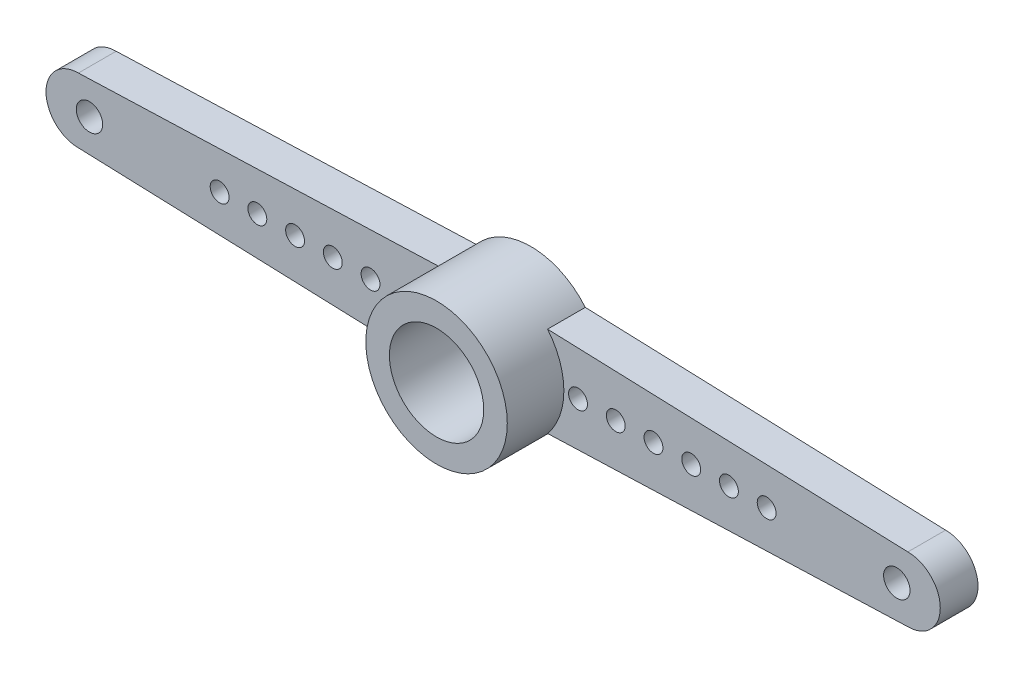
ISO-10303-21;
HEADER;
FILE_DESCRIPTION(('STEP AP214'),'2;1');
FILE_NAME('part.step','',(''),(''),'','','');
FILE_SCHEMA(('AUTOMOTIVE_DESIGN { 1 0 10303 214 1 1 1 1 }'));
ENDSEC;
DATA;
#1=APPLICATION_CONTEXT('core data for automotive mechanical design processes');
#2=APPLICATION_PROTOCOL_DEFINITION('international standard','automotive_design',2000,#1);
#3=PRODUCT_CONTEXT('',#1,'mechanical');
#4=PRODUCT('Part','Part','',(#3));
#5=PRODUCT_RELATED_PRODUCT_CATEGORY('part','',(#4));
#6=PRODUCT_DEFINITION_FORMATION('','',#4);
#7=PRODUCT_DEFINITION_CONTEXT('part definition',#1,'design');
#8=PRODUCT_DEFINITION('design','',#6,#7);
#9=PRODUCT_DEFINITION_SHAPE('','',#8);
#10=(LENGTH_UNIT() NAMED_UNIT(*) SI_UNIT(.MILLI.,.METRE.));
#11=(NAMED_UNIT(*) PLANE_ANGLE_UNIT() SI_UNIT($,.RADIAN.));
#12=(NAMED_UNIT(*) SI_UNIT($,.STERADIAN.) SOLID_ANGLE_UNIT());
#13=UNCERTAINTY_MEASURE_WITH_UNIT(LENGTH_MEASURE(1.E-05),#10,'distance_accuracy_value','');
#14=(GEOMETRIC_REPRESENTATION_CONTEXT(3) GLOBAL_UNCERTAINTY_ASSIGNED_CONTEXT((#13)) GLOBAL_UNIT_ASSIGNED_CONTEXT((#10,
#11,#12)) REPRESENTATION_CONTEXT('',''));
#15=CARTESIAN_POINT('',(0.,0.,0.));
#16=DIRECTION('',(0.,0.,1.));
#17=DIRECTION('',(1.,0.,0.));
#18=AXIS2_PLACEMENT_3D('',#15,#16,#17);
#19=CARTESIAN_POINT('',(0.,0.,0.));
#20=DIRECTION('',(0.,0.,1.));
#21=DIRECTION('',(1.,0.,0.));
#22=AXIS2_PLACEMENT_3D('',#19,#20,#21);
#23=CYLINDRICAL_SURFACE('',#22,2.5);
#24=CARTESIAN_POINT('',(0.,0.,5.));
#25=DIRECTION('',(0.,0.,1.));
#26=DIRECTION('',(1.,0.,0.));
#27=AXIS2_PLACEMENT_3D('',#24,#25,#26);
#28=CIRCLE('',#27,2.5);
#29=CARTESIAN_POINT('',(2.5,0.,5.));
#30=VERTEX_POINT('',#29);
#31=EDGE_CURVE('E215',#30,#30,#28,.T.);
#32=ORIENTED_EDGE('',*,*,#31,.T.);
#33=EDGE_LOOP('',(#32));
#34=FACE_BOUND('',#33,.T.);
#35=CARTESIAN_POINT('',(0.,0.,1.));
#36=DIRECTION('',(0.,0.,-1.));
#37=DIRECTION('',(-1.,0.,0.));
#38=AXIS2_PLACEMENT_3D('',#35,#36,#37);
#39=CIRCLE('',#38,2.5);
#40=CARTESIAN_POINT('',(-2.5,0.,1.));
#41=VERTEX_POINT('',#40);
#42=EDGE_CURVE('E288',#41,#41,#39,.T.);
#43=ORIENTED_EDGE('',*,*,#42,.T.);
#44=EDGE_LOOP('',(#43));
#45=FACE_BOUND('',#44,.T.);
#46=ADVANCED_FACE('F43',(#34,#45),#23,.F.);
#47=CARTESIAN_POINT('',(0.,0.,2.));
#48=DIRECTION('',(0.,0.,1.));
#49=DIRECTION('',(1.,0.,0.));
#50=AXIS2_PLACEMENT_3D('',#47,#48,#49);
#51=PLANE('',#50);
#52=CARTESIAN_POINT('',(-21.4,0.,2.));
#53=DIRECTION('',(0.,0.,-1.));
#54=DIRECTION('',(-1.,0.,0.));
#55=AXIS2_PLACEMENT_3D('',#52,#53,#54);
#56=CIRCLE('',#55,0.699999999999998);
#57=CARTESIAN_POINT('',(-22.1,0.,2.));
#58=VERTEX_POINT('',#57);
#59=EDGE_CURVE('E305',#58,#58,#56,.T.);
#60=ORIENTED_EDGE('',*,*,#59,.T.);
#61=EDGE_LOOP('',(#60));
#62=FACE_BOUND('',#61,.T.);
#63=CARTESIAN_POINT('',(-12.5,0.,2.));
#64=DIRECTION('',(0.,0.,-1.));
#65=DIRECTION('',(-1.,0.,0.));
#66=AXIS2_PLACEMENT_3D('',#63,#64,#65);
#67=CIRCLE('',#66,0.500000000000001);
#68=CARTESIAN_POINT('',(-13.,0.,2.));
#69=VERTEX_POINT('',#68);
#70=EDGE_CURVE('E273',#69,#69,#67,.F.);
#71=ORIENTED_EDGE('',*,*,#70,.F.);
#72=EDGE_LOOP('',(#71));
#73=FACE_BOUND('',#72,.T.);
#74=CARTESIAN_POINT('',(-8.5,0.,2.));
#75=DIRECTION('',(0.,0.,-1.));
#76=DIRECTION('',(-1.,0.,0.));
#77=AXIS2_PLACEMENT_3D('',#74,#75,#76);
#78=CIRCLE('',#77,0.500000000000001);
#79=CARTESIAN_POINT('',(-9.,0.,2.));
#80=VERTEX_POINT('',#79);
#81=EDGE_CURVE('E261',#80,#80,#78,.F.);
#82=ORIENTED_EDGE('',*,*,#81,.F.);
#83=EDGE_LOOP('',(#82));
#84=FACE_BOUND('',#83,.T.);
#85=CARTESIAN_POINT('',(-4.5,0.,2.));
#86=DIRECTION('',(0.,0.,-1.));
#87=DIRECTION('',(-1.,0.,0.));
#88=AXIS2_PLACEMENT_3D('',#85,#86,#87);
#89=CIRCLE('',#88,0.500000000000001);
#90=CARTESIAN_POINT('',(-5.,0.,2.));
#91=VERTEX_POINT('',#90);
#92=EDGE_CURVE('E249',#91,#91,#89,.F.);
#93=ORIENTED_EDGE('',*,*,#92,.F.);
#94=EDGE_LOOP('',(#93));
#95=FACE_BOUND('',#94,.T.);
#96=CARTESIAN_POINT('',(0.,0.,2.));
#97=DIRECTION('',(0.,0.,1.));
#98=DIRECTION('',(1.,0.,0.));
#99=AXIS2_PLACEMENT_3D('',#96,#97,#98);
#100=CIRCLE('',#99,3.75);
#101=CARTESIAN_POINT('',(-2.88547071027724,2.39511143376089,2.));
#102=VERTEX_POINT('',#101);
#103=CARTESIAN_POINT('',(-2.88547071027724,-2.39511143376089,2.));
#104=VERTEX_POINT('',#103);
#105=EDGE_CURVE('E12',#102,#104,#100,.T.);
#106=ORIENTED_EDGE('',*,*,#105,.F.);
#107=DIRECTION('',(0.999372730394994,0.0354139201848026,0.));
#108=VECTOR('',#107,1.);
#109=CARTESIAN_POINT('',(-0.0883858807695831,2.49422934631706,2.));
#110=LINE('',#109,#108);
#111=CARTESIAN_POINT('',(-21.9862000686899,1.71825515742145,2.));
#112=VERTEX_POINT('',#111);
#113=EDGE_CURVE('E174',#112,#102,#110,.T.);
#114=ORIENTED_EDGE('',*,*,#113,.F.);
#115=CARTESIAN_POINT('',(-21.9862000686899,0.,2.));
#116=DIRECTION('',(0.,0.,1.));
#117=DIRECTION('',(1.,0.,0.));
#118=AXIS2_PLACEMENT_3D('',#115,#116,#117);
#119=CIRCLE('',#118,1.71825515742145);
#120=CARTESIAN_POINT('',(-21.9862000686899,-1.71825515742145,2.));
#121=VERTEX_POINT('',#120);
#122=EDGE_CURVE('E181',#112,#121,#119,.T.);
#123=ORIENTED_EDGE('',*,*,#122,.T.);
#124=DIRECTION('',(0.999372730394994,-0.0354139201848024,0.));
#125=VECTOR('',#124,1.);
#126=CARTESIAN_POINT('',(-0.0883858807695825,-2.49422934631706,2.));
#127=LINE('',#126,#125);
#128=EDGE_CURVE('E186',#121,#104,#127,.T.);
#129=ORIENTED_EDGE('',*,*,#128,.T.);
#130=EDGE_LOOP('',(#106,#114,#123,#129));
#131=FACE_BOUND('',#130,.T.);
#132=CARTESIAN_POINT('',(-6.5,0.,2.));
#133=DIRECTION('',(0.,0.,-1.));
#134=DIRECTION('',(-1.,0.,0.));
#135=AXIS2_PLACEMENT_3D('',#132,#133,#134);
#136=CIRCLE('',#135,0.500000000000001);
#137=CARTESIAN_POINT('',(-7.,0.,2.));
#138=VERTEX_POINT('',#137);
#139=EDGE_CURVE('E255',#138,#138,#136,.F.);
#140=ORIENTED_EDGE('',*,*,#139,.F.);
#141=EDGE_LOOP('',(#140));
#142=FACE_BOUND('',#141,.T.);
#143=CARTESIAN_POINT('',(-10.5,0.,2.));
#144=DIRECTION('',(0.,0.,-1.));
#145=DIRECTION('',(-1.,0.,0.));
#146=AXIS2_PLACEMENT_3D('',#143,#144,#145);
#147=CIRCLE('',#146,0.500000000000001);
#148=CARTESIAN_POINT('',(-11.,0.,2.));
#149=VERTEX_POINT('',#148);
#150=EDGE_CURVE('E267',#149,#149,#147,.F.);
#151=ORIENTED_EDGE('',*,*,#150,.F.);
#152=EDGE_LOOP('',(#151));
#153=FACE_BOUND('',#152,.T.);
#154=CARTESIAN_POINT('',(-14.5,0.,2.));
#155=DIRECTION('',(0.,0.,-1.));
#156=DIRECTION('',(-1.,0.,0.));
#157=AXIS2_PLACEMENT_3D('',#154,#155,#156);
#158=CIRCLE('',#157,0.500000000000001);
#159=CARTESIAN_POINT('',(-15.,0.,2.));
#160=VERTEX_POINT('',#159);
#161=EDGE_CURVE('E279',#160,#160,#158,.F.);
#162=ORIENTED_EDGE('',*,*,#161,.F.);
#163=EDGE_LOOP('',(#162));
#164=FACE_BOUND('',#163,.T.);
#165=ADVANCED_FACE('F188',(#62,#73,#84,#95,#131,#142,#153,#164),#51,.T.);
#166=CARTESIAN_POINT('',(0.,0.,0.));
#167=DIRECTION('',(0.,0.,1.));
#168=DIRECTION('',(1.,0.,0.));
#169=AXIS2_PLACEMENT_3D('',#166,#167,#168);
#170=PLANE('',#169);
#171=CARTESIAN_POINT('',(21.4,0.,0.));
#172=DIRECTION('',(0.,0.,-1.));
#173=DIRECTION('',(-1.,0.,0.));
#174=AXIS2_PLACEMENT_3D('',#171,#172,#173);
#175=CIRCLE('',#174,0.699999999999998);
#176=CARTESIAN_POINT('',(20.7,0.,0.));
#177=VERTEX_POINT('',#176);
#178=EDGE_CURVE('E312',#177,#177,#175,.T.);
#179=ORIENTED_EDGE('',*,*,#178,.F.);
#180=EDGE_LOOP('',(#179));
#181=FACE_BOUND('',#180,.T.);
#182=CARTESIAN_POINT('',(-21.4,0.,0.));
#183=DIRECTION('',(0.,0.,-1.));
#184=DIRECTION('',(-1.,0.,0.));
#185=AXIS2_PLACEMENT_3D('',#182,#183,#184);
#186=CIRCLE('',#185,0.699999999999998);
#187=CARTESIAN_POINT('',(-22.1,0.,0.));
#188=VERTEX_POINT('',#187);
#189=EDGE_CURVE('E306',#188,#188,#186,.T.);
#190=ORIENTED_EDGE('',*,*,#189,.F.);
#191=EDGE_LOOP('',(#190));
#192=FACE_BOUND('',#191,.T.);
#193=CARTESIAN_POINT('',(0.,0.,0.));
#194=DIRECTION('',(0.,0.,-1.));
#195=DIRECTION('',(-1.,0.,0.));
#196=AXIS2_PLACEMENT_3D('',#193,#194,#195);
#197=CIRCLE('',#196,2.5);
#198=CARTESIAN_POINT('',(-2.5,0.,0.));
#199=VERTEX_POINT('',#198);
#200=EDGE_CURVE('E294',#199,#199,#197,.T.);
#201=ORIENTED_EDGE('',*,*,#200,.F.);
#202=EDGE_LOOP('',(#201));
#203=FACE_BOUND('',#202,.T.);
#204=CARTESIAN_POINT('',(12.5,0.,0.));
#205=DIRECTION('',(0.,0.,-1.));
#206=DIRECTION('',(-1.,0.,0.));
#207=AXIS2_PLACEMENT_3D('',#204,#205,#206);
#208=CIRCLE('',#207,0.500000000000001);
#209=CARTESIAN_POINT('',(12.,0.,0.));
#210=VERTEX_POINT('',#209);
#211=EDGE_CURVE('E282',#210,#210,#208,.T.);
#212=ORIENTED_EDGE('',*,*,#211,.F.);
#213=EDGE_LOOP('',(#212));
#214=FACE_BOUND('',#213,.T.);
#215=CARTESIAN_POINT('',(4.5,0.,0.));
#216=DIRECTION('',(0.,0.,-1.));
#217=DIRECTION('',(-1.,0.,0.));
#218=AXIS2_PLACEMENT_3D('',#215,#216,#217);
#219=CIRCLE('',#218,0.500000000000001);
#220=CARTESIAN_POINT('',(4.,0.,0.));
#221=VERTEX_POINT('',#220);
#222=EDGE_CURVE('E240',#221,#221,#219,.T.);
#223=ORIENTED_EDGE('',*,*,#222,.F.);
#224=EDGE_LOOP('',(#223));
#225=FACE_BOUND('',#224,.T.);
#226=CARTESIAN_POINT('',(6.5,0.,0.));
#227=DIRECTION('',(0.,0.,-1.));
#228=DIRECTION('',(-1.,0.,0.));
#229=AXIS2_PLACEMENT_3D('',#226,#227,#228);
#230=CIRCLE('',#229,0.500000000000001);
#231=CARTESIAN_POINT('',(6.,0.,0.));
#232=VERTEX_POINT('',#231);
#233=EDGE_CURVE('E234',#232,#232,#230,.T.);
#234=ORIENTED_EDGE('',*,*,#233,.F.);
#235=EDGE_LOOP('',(#234));
#236=FACE_BOUND('',#235,.T.);
#237=CARTESIAN_POINT('',(8.5,0.,0.));
#238=DIRECTION('',(0.,0.,-1.));
#239=DIRECTION('',(-1.,0.,0.));
#240=AXIS2_PLACEMENT_3D('',#237,#238,#239);
#241=CIRCLE('',#240,0.500000000000001);
#242=CARTESIAN_POINT('',(8.,0.,0.));
#243=VERTEX_POINT('',#242);
#244=EDGE_CURVE('E228',#243,#243,#241,.T.);
#245=ORIENTED_EDGE('',*,*,#244,.F.);
#246=EDGE_LOOP('',(#245));
#247=FACE_BOUND('',#246,.T.);
#248=CARTESIAN_POINT('',(10.5,0.,0.));
#249=DIRECTION('',(0.,0.,-1.));
#250=DIRECTION('',(-1.,0.,0.));
#251=AXIS2_PLACEMENT_3D('',#248,#249,#250);
#252=CIRCLE('',#251,0.500000000000001);
#253=CARTESIAN_POINT('',(10.,0.,0.));
#254=VERTEX_POINT('',#253);
#255=EDGE_CURVE('E222',#254,#254,#252,.T.);
#256=ORIENTED_EDGE('',*,*,#255,.F.);
#257=EDGE_LOOP('',(#256));
#258=FACE_BOUND('',#257,.T.);
#259=CARTESIAN_POINT('',(14.5,0.,0.));
#260=DIRECTION('',(0.,0.,-1.));
#261=DIRECTION('',(-1.,0.,0.));
#262=AXIS2_PLACEMENT_3D('',#259,#260,#261);
#263=CIRCLE('',#262,0.500000000000001);
#264=CARTESIAN_POINT('',(14.,0.,0.));
#265=VERTEX_POINT('',#264);
#266=EDGE_CURVE('E219',#265,#265,#263,.T.);
#267=ORIENTED_EDGE('',*,*,#266,.F.);
#268=EDGE_LOOP('',(#267));
#269=FACE_BOUND('',#268,.T.);
#270=CARTESIAN_POINT('',(21.9862000686899,0.,0.));
#271=DIRECTION('',(0.,0.,1.));
#272=DIRECTION('',(1.,0.,0.));
#273=AXIS2_PLACEMENT_3D('',#270,#271,#272);
#274=CIRCLE('',#273,1.71825515742145);
#275=CARTESIAN_POINT('',(21.9862000686899,1.71825515742145,0.));
#276=VERTEX_POINT('',#275);
#277=CARTESIAN_POINT('',(21.9862000686899,-1.71825515742144,0.));
#278=VERTEX_POINT('',#277);
#279=EDGE_CURVE('E84',#276,#278,#274,.F.);
#280=ORIENTED_EDGE('',*,*,#279,.T.);
#281=DIRECTION('',(-0.999372730394994,-0.0354139201848029,0.));
#282=VECTOR('',#281,1.);
#283=CARTESIAN_POINT('',(0.0883858807695838,-2.49422934631706,0.));
#284=LINE('',#283,#282);
#285=CARTESIAN_POINT('',(2.88547071027724,-2.39511143376089,0.));
#286=VERTEX_POINT('',#285);
#287=EDGE_CURVE('E97',#278,#286,#284,.T.);
#288=ORIENTED_EDGE('',*,*,#287,.T.);
#289=CARTESIAN_POINT('',(0.,0.,0.));
#290=DIRECTION('',(0.,0.,-1.));
#291=DIRECTION('',(-1.,0.,0.));
#292=AXIS2_PLACEMENT_3D('',#289,#290,#291);
#293=CIRCLE('',#292,3.75);
#294=CARTESIAN_POINT('',(-2.88547071027724,-2.39511143376089,0.));
#295=VERTEX_POINT('',#294);
#296=EDGE_CURVE('E100',#286,#295,#293,.T.);
#297=ORIENTED_EDGE('',*,*,#296,.T.);
#298=DIRECTION('',(0.999372730394994,-0.0354139201848024,0.));
#299=VECTOR('',#298,1.);
#300=CARTESIAN_POINT('',(-0.0883858807695825,-2.49422934631706,0.));
#301=LINE('',#300,#299);
#302=CARTESIAN_POINT('',(-21.9862000686899,-1.71825515742145,0.));
#303=VERTEX_POINT('',#302);
#304=EDGE_CURVE('E190',#303,#295,#301,.T.);
#305=ORIENTED_EDGE('',*,*,#304,.F.);
#306=CARTESIAN_POINT('',(-21.9862000686899,0.,0.));
#307=DIRECTION('',(0.,0.,1.));
#308=DIRECTION('',(1.,0.,0.));
#309=AXIS2_PLACEMENT_3D('',#306,#307,#308);
#310=CIRCLE('',#309,1.71825515742145);
#311=CARTESIAN_POINT('',(-21.9862000686899,1.71825515742145,0.));
#312=VERTEX_POINT('',#311);
#313=EDGE_CURVE('E192',#312,#303,#310,.T.);
#314=ORIENTED_EDGE('',*,*,#313,.F.);
#315=DIRECTION('',(0.999372730394994,0.0354139201848026,0.));
#316=VECTOR('',#315,1.);
#317=CARTESIAN_POINT('',(-0.0883858807695831,2.49422934631706,0.));
#318=LINE('',#317,#316);
#319=CARTESIAN_POINT('',(-2.88547071027724,2.39511143376089,0.));
#320=VERTEX_POINT('',#319);
#321=EDGE_CURVE('E60',#312,#320,#318,.T.);
#322=ORIENTED_EDGE('',*,*,#321,.T.);
#323=CARTESIAN_POINT('',(2.88547071027724,2.39511143376089,0.));
#324=VERTEX_POINT('',#323);
#325=EDGE_CURVE('E177',#320,#324,#293,.T.);
#326=ORIENTED_EDGE('',*,*,#325,.T.);
#327=DIRECTION('',(-0.999372730394994,0.0354139201848023,0.));
#328=VECTOR('',#327,1.);
#329=CARTESIAN_POINT('',(0.0883858807695825,2.49422934631706,0.));
#330=LINE('',#329,#328);
#331=EDGE_CURVE('E99',#276,#324,#330,.T.);
#332=ORIENTED_EDGE('',*,*,#331,.F.);
#333=EDGE_LOOP('',(#280,#288,#297,#305,#314,#322,#326,#332));
#334=FACE_BOUND('',#333,.T.);
#335=CARTESIAN_POINT('',(-4.5,0.,0.));
#336=DIRECTION('',(0.,0.,-1.));
#337=DIRECTION('',(-1.,0.,0.));
#338=AXIS2_PLACEMENT_3D('',#335,#336,#337);
#339=CIRCLE('',#338,0.500000000000001);
#340=CARTESIAN_POINT('',(-5.,0.,0.));
#341=VERTEX_POINT('',#340);
#342=EDGE_CURVE('E246',#341,#341,#339,.F.);
#343=ORIENTED_EDGE('',*,*,#342,.T.);
#344=EDGE_LOOP('',(#343));
#345=FACE_BOUND('',#344,.T.);
#346=CARTESIAN_POINT('',(-6.5,0.,0.));
#347=DIRECTION('',(0.,0.,-1.));
#348=DIRECTION('',(-1.,0.,0.));
#349=AXIS2_PLACEMENT_3D('',#346,#347,#348);
#350=CIRCLE('',#349,0.500000000000001);
#351=CARTESIAN_POINT('',(-7.,0.,0.));
#352=VERTEX_POINT('',#351);
#353=EDGE_CURVE('E252',#352,#352,#350,.F.);
#354=ORIENTED_EDGE('',*,*,#353,.T.);
#355=EDGE_LOOP('',(#354));
#356=FACE_BOUND('',#355,.T.);
#357=CARTESIAN_POINT('',(-8.5,0.,0.));
#358=DIRECTION('',(0.,0.,-1.));
#359=DIRECTION('',(-1.,0.,0.));
#360=AXIS2_PLACEMENT_3D('',#357,#358,#359);
#361=CIRCLE('',#360,0.500000000000001);
#362=CARTESIAN_POINT('',(-9.,0.,0.));
#363=VERTEX_POINT('',#362);
#364=EDGE_CURVE('E258',#363,#363,#361,.F.);
#365=ORIENTED_EDGE('',*,*,#364,.T.);
#366=EDGE_LOOP('',(#365));
#367=FACE_BOUND('',#366,.T.);
#368=CARTESIAN_POINT('',(-10.5,0.,0.));
#369=DIRECTION('',(0.,0.,-1.));
#370=DIRECTION('',(-1.,0.,0.));
#371=AXIS2_PLACEMENT_3D('',#368,#369,#370);
#372=CIRCLE('',#371,0.500000000000001);
#373=CARTESIAN_POINT('',(-11.,0.,0.));
#374=VERTEX_POINT('',#373);
#375=EDGE_CURVE('E264',#374,#374,#372,.F.);
#376=ORIENTED_EDGE('',*,*,#375,.T.);
#377=EDGE_LOOP('',(#376));
#378=FACE_BOUND('',#377,.T.);
#379=CARTESIAN_POINT('',(-12.5,0.,0.));
#380=DIRECTION('',(0.,0.,-1.));
#381=DIRECTION('',(-1.,0.,0.));
#382=AXIS2_PLACEMENT_3D('',#379,#380,#381);
#383=CIRCLE('',#382,0.500000000000001);
#384=CARTESIAN_POINT('',(-13.,0.,0.));
#385=VERTEX_POINT('',#384);
#386=EDGE_CURVE('E270',#385,#385,#383,.F.);
#387=ORIENTED_EDGE('',*,*,#386,.T.);
#388=EDGE_LOOP('',(#387));
#389=FACE_BOUND('',#388,.T.);
#390=CARTESIAN_POINT('',(-14.5,0.,0.));
#391=DIRECTION('',(0.,0.,-1.));
#392=DIRECTION('',(-1.,0.,0.));
#393=AXIS2_PLACEMENT_3D('',#390,#391,#392);
#394=CIRCLE('',#393,0.500000000000001);
#395=CARTESIAN_POINT('',(-15.,0.,0.));
#396=VERTEX_POINT('',#395);
#397=EDGE_CURVE('E276',#396,#396,#394,.F.);
#398=ORIENTED_EDGE('',*,*,#397,.T.);
#399=EDGE_LOOP('',(#398));
#400=FACE_BOUND('',#399,.T.);
#401=ADVANCED_FACE('F93',(#181,#192,#203,#214,#225,#236,#247,#258,#269,#334,#345,#356,#367,#378,
#389,#400),#170,.F.);
#402=CARTESIAN_POINT('',(21.9862000686899,0.,2.));
#403=DIRECTION('',(0.,0.,-1.));
#404=DIRECTION('',(-1.,0.,0.));
#405=AXIS2_PLACEMENT_3D('',#402,#403,#404);
#406=CYLINDRICAL_SURFACE('',#405,1.71825515742145);
#407=ORIENTED_EDGE('',*,*,#279,.F.);
#408=DIRECTION('',(0.,0.,-1.));
#409=VECTOR('',#408,1.);
#410=CARTESIAN_POINT('',(21.9862000686899,1.71825515742145,2.));
#411=LINE('',#410,#409);
#412=CARTESIAN_POINT('',(21.9862000686899,1.71825515742145,2.));
#413=VERTEX_POINT('',#412);
#414=EDGE_CURVE('E110',#413,#276,#411,.T.);
#415=ORIENTED_EDGE('',*,*,#414,.F.);
#416=CARTESIAN_POINT('',(21.9862000686899,0.,2.));
#417=DIRECTION('',(0.,0.,1.));
#418=DIRECTION('',(1.,0.,0.));
#419=AXIS2_PLACEMENT_3D('',#416,#417,#418);
#420=CIRCLE('',#419,1.71825515742145);
#421=CARTESIAN_POINT('',(21.9862000686899,-1.71825515742144,2.));
#422=VERTEX_POINT('',#421);
#423=EDGE_CURVE('E86',#413,#422,#420,.F.);
#424=ORIENTED_EDGE('',*,*,#423,.T.);
#425=DIRECTION('',(0.,0.,-1.));
#426=VECTOR('',#425,1.);
#427=CARTESIAN_POINT('',(21.9862000686899,-1.71825515742144,2.));
#428=LINE('',#427,#426);
#429=EDGE_CURVE('E69',#422,#278,#428,.T.);
#430=ORIENTED_EDGE('',*,*,#429,.T.);
#431=EDGE_LOOP('',(#407,#415,#424,#430));
#432=FACE_BOUND('',#431,.T.);
#433=ADVANCED_FACE('F45',(#432),#406,.T.);
#434=CARTESIAN_POINT('',(0.0883858807695825,2.49422934631706,2.));
#435=DIRECTION('',(-0.0354139201848023,-0.999372730394994,0.));
#436=DIRECTION('',(0.999372730394994,-0.0354139201848023,0.));
#437=AXIS2_PLACEMENT_3D('',#434,#435,#436);
#438=PLANE('',#437);
#439=ORIENTED_EDGE('',*,*,#331,.T.);
#440=DIRECTION('',(0.,0.,-1.));
#441=VECTOR('',#440,1.);
#442=CARTESIAN_POINT('',(2.88547071027724,2.39511143376089,2.));
#443=LINE('',#442,#441);
#444=CARTESIAN_POINT('',(2.88547071027724,2.39511143376089,2.));
#445=VERTEX_POINT('',#444);
#446=EDGE_CURVE('E112',#445,#324,#443,.T.);
#447=ORIENTED_EDGE('',*,*,#446,.F.);
#448=DIRECTION('',(-0.999372730394994,0.0354139201848023,0.));
#449=VECTOR('',#448,1.);
#450=CARTESIAN_POINT('',(0.0883858807695825,2.49422934631706,2.));
#451=LINE('',#450,#449);
#452=EDGE_CURVE('E106',#413,#445,#451,.T.);
#453=ORIENTED_EDGE('',*,*,#452,.F.);
#454=ORIENTED_EDGE('',*,*,#414,.T.);
#455=EDGE_LOOP('',(#439,#447,#453,#454));
#456=FACE_BOUND('',#455,.T.);
#457=ADVANCED_FACE('F378',(#456),#438,.F.);
#458=CARTESIAN_POINT('',(0.0883858807695838,-2.49422934631706,2.));
#459=DIRECTION('',(0.0354139201848029,-0.999372730394994,0.));
#460=DIRECTION('',(0.999372730394994,0.0354139201848029,0.));
#461=AXIS2_PLACEMENT_3D('',#458,#459,#460);
#462=PLANE('',#461);
#463=ORIENTED_EDGE('',*,*,#287,.F.);
#464=ORIENTED_EDGE('',*,*,#429,.F.);
#465=DIRECTION('',(-0.999372730394994,-0.0354139201848029,0.));
#466=VECTOR('',#465,1.);
#467=CARTESIAN_POINT('',(0.0883858807695838,-2.49422934631706,2.));
#468=LINE('',#467,#466);
#469=CARTESIAN_POINT('',(2.88547071027724,-2.39511143376089,2.));
#470=VERTEX_POINT('',#469);
#471=EDGE_CURVE('E89',#422,#470,#468,.T.);
#472=ORIENTED_EDGE('',*,*,#471,.T.);
#473=DIRECTION('',(0.,0.,-1.));
#474=VECTOR('',#473,1.);
#475=CARTESIAN_POINT('',(2.88547071027724,-2.39511143376089,2.));
#476=LINE('',#475,#474);
#477=EDGE_CURVE('E88',#470,#286,#476,.T.);
#478=ORIENTED_EDGE('',*,*,#477,.T.);
#479=EDGE_LOOP('',(#463,#464,#472,#478));
#480=FACE_BOUND('',#479,.T.);
#481=ADVANCED_FACE('F103',(#480),#462,.T.);
#482=CARTESIAN_POINT('',(21.4,0.,2.));
#483=DIRECTION('',(0.,0.,-1.));
#484=DIRECTION('',(-1.,0.,0.));
#485=AXIS2_PLACEMENT_3D('',#482,#483,#484);
#486=CIRCLE('',#485,0.699999999999998);
#487=CARTESIAN_POINT('',(20.7,0.,2.));
#488=VERTEX_POINT('',#487);
#489=EDGE_CURVE('E309',#488,#488,#486,.T.);
#490=ORIENTED_EDGE('',*,*,#489,.T.);
#491=EDGE_LOOP('',(#490));
#492=FACE_BOUND('',#491,.T.);
#493=CARTESIAN_POINT('',(12.5,0.,2.));
#494=DIRECTION('',(0.,0.,-1.));
#495=DIRECTION('',(-1.,0.,0.));
#496=AXIS2_PLACEMENT_3D('',#493,#494,#495);
#497=CIRCLE('',#496,0.500000000000001);
#498=CARTESIAN_POINT('',(12.,0.,2.));
#499=VERTEX_POINT('',#498);
#500=EDGE_CURVE('E285',#499,#499,#497,.T.);
#501=ORIENTED_EDGE('',*,*,#500,.T.);
#502=EDGE_LOOP('',(#501));
#503=FACE_BOUND('',#502,.T.);
#504=CARTESIAN_POINT('',(4.5,0.,2.));
#505=DIRECTION('',(0.,0.,-1.));
#506=DIRECTION('',(-1.,0.,0.));
#507=AXIS2_PLACEMENT_3D('',#504,#505,#506);
#508=CIRCLE('',#507,0.500000000000001);
#509=CARTESIAN_POINT('',(4.,0.,2.));
#510=VERTEX_POINT('',#509);
#511=EDGE_CURVE('E243',#510,#510,#508,.T.);
#512=ORIENTED_EDGE('',*,*,#511,.T.);
#513=EDGE_LOOP('',(#512));
#514=FACE_BOUND('',#513,.T.);
#515=CARTESIAN_POINT('',(6.5,0.,2.));
#516=DIRECTION('',(0.,0.,-1.));
#517=DIRECTION('',(-1.,0.,0.));
#518=AXIS2_PLACEMENT_3D('',#515,#516,#517);
#519=CIRCLE('',#518,0.500000000000001);
#520=CARTESIAN_POINT('',(6.,0.,2.));
#521=VERTEX_POINT('',#520);
#522=EDGE_CURVE('E237',#521,#521,#519,.T.);
#523=ORIENTED_EDGE('',*,*,#522,.T.);
#524=EDGE_LOOP('',(#523));
#525=FACE_BOUND('',#524,.T.);
#526=CARTESIAN_POINT('',(8.5,0.,2.));
#527=DIRECTION('',(0.,0.,-1.));
#528=DIRECTION('',(-1.,0.,0.));
#529=AXIS2_PLACEMENT_3D('',#526,#527,#528);
#530=CIRCLE('',#529,0.500000000000001);
#531=CARTESIAN_POINT('',(8.,0.,2.));
#532=VERTEX_POINT('',#531);
#533=EDGE_CURVE('E231',#532,#532,#530,.T.);
#534=ORIENTED_EDGE('',*,*,#533,.T.);
#535=EDGE_LOOP('',(#534));
#536=FACE_BOUND('',#535,.T.);
#537=CARTESIAN_POINT('',(10.5,0.,2.));
#538=DIRECTION('',(0.,0.,-1.));
#539=DIRECTION('',(-1.,0.,0.));
#540=AXIS2_PLACEMENT_3D('',#537,#538,#539);
#541=CIRCLE('',#540,0.500000000000001);
#542=CARTESIAN_POINT('',(10.,0.,2.));
#543=VERTEX_POINT('',#542);
#544=EDGE_CURVE('E225',#543,#543,#541,.T.);
#545=ORIENTED_EDGE('',*,*,#544,.T.);
#546=EDGE_LOOP('',(#545));
#547=FACE_BOUND('',#546,.T.);
#548=CARTESIAN_POINT('',(14.5,0.,2.));
#549=DIRECTION('',(0.,0.,-1.));
#550=DIRECTION('',(-1.,0.,0.));
#551=AXIS2_PLACEMENT_3D('',#548,#549,#550);
#552=CIRCLE('',#551,0.500000000000001);
#553=CARTESIAN_POINT('',(14.,0.,2.));
#554=VERTEX_POINT('',#553);
#555=EDGE_CURVE('E218',#554,#554,#552,.T.);
#556=ORIENTED_EDGE('',*,*,#555,.T.);
#557=EDGE_LOOP('',(#556));
#558=FACE_BOUND('',#557,.T.);
#559=EDGE_CURVE('E52',#470,#445,#100,.T.);
#560=ORIENTED_EDGE('',*,*,#559,.F.);
#561=ORIENTED_EDGE('',*,*,#471,.F.);
#562=ORIENTED_EDGE('',*,*,#423,.F.);
#563=ORIENTED_EDGE('',*,*,#452,.T.);
#564=EDGE_LOOP('',(#560,#561,#562,#563));
#565=FACE_BOUND('',#564,.T.);
#566=ADVANCED_FACE('F135',(#492,#503,#514,#525,#536,#547,#558,#565),#51,.T.);
#567=CARTESIAN_POINT('',(0.,0.,0.));
#568=DIRECTION('',(0.,0.,1.));
#569=DIRECTION('',(1.,0.,0.));
#570=AXIS2_PLACEMENT_3D('',#567,#568,#569);
#571=CYLINDRICAL_SURFACE('',#570,3.75);
#572=ORIENTED_EDGE('',*,*,#325,.F.);
#573=DIRECTION('',(0.,0.,-1.));
#574=VECTOR('',#573,1.);
#575=CARTESIAN_POINT('',(-2.88547071027724,2.39511143376089,2.));
#576=LINE('',#575,#574);
#577=EDGE_CURVE('E199',#102,#320,#576,.T.);
#578=ORIENTED_EDGE('',*,*,#577,.F.);
#579=ORIENTED_EDGE('',*,*,#105,.T.);
#580=DIRECTION('',(0.,0.,-1.));
#581=VECTOR('',#580,1.);
#582=CARTESIAN_POINT('',(-2.88547071027724,-2.39511143376089,2.));
#583=LINE('',#582,#581);
#584=EDGE_CURVE('E200',#104,#295,#583,.T.);
#585=ORIENTED_EDGE('',*,*,#584,.T.);
#586=ORIENTED_EDGE('',*,*,#296,.F.);
#587=ORIENTED_EDGE('',*,*,#477,.F.);
#588=ORIENTED_EDGE('',*,*,#559,.T.);
#589=ORIENTED_EDGE('',*,*,#446,.T.);
#590=EDGE_LOOP('',(#572,#578,#579,#585,#586,#587,#588,#589));
#591=FACE_BOUND('',#590,.T.);
#592=CARTESIAN_POINT('',(0.,0.,5.));
#593=DIRECTION('',(0.,0.,1.));
#594=DIRECTION('',(1.,0.,0.));
#595=AXIS2_PLACEMENT_3D('',#592,#593,#594);
#596=CIRCLE('',#595,3.75);
#597=CARTESIAN_POINT('',(3.75,0.,5.));
#598=VERTEX_POINT('',#597);
#599=EDGE_CURVE('E211',#598,#598,#596,.T.);
#600=ORIENTED_EDGE('',*,*,#599,.F.);
#601=EDGE_LOOP('',(#600));
#602=FACE_BOUND('',#601,.T.);
#603=ADVANCED_FACE('F143',(#591,#602),#571,.T.);
#604=CARTESIAN_POINT('',(-0.0883858807695831,2.49422934631706,2.));
#605=DIRECTION('',(-0.0354139201848026,0.999372730394994,0.));
#606=DIRECTION('',(-0.999372730394994,-0.0354139201848026,0.));
#607=AXIS2_PLACEMENT_3D('',#604,#605,#606);
#608=PLANE('',#607);
#609=ORIENTED_EDGE('',*,*,#321,.F.);
#610=DIRECTION('',(0.,0.,-1.));
#611=VECTOR('',#610,1.);
#612=CARTESIAN_POINT('',(-21.9862000686899,1.71825515742145,2.));
#613=LINE('',#612,#611);
#614=EDGE_CURVE('E170',#112,#312,#613,.T.);
#615=ORIENTED_EDGE('',*,*,#614,.F.);
#616=ORIENTED_EDGE('',*,*,#113,.T.);
#617=ORIENTED_EDGE('',*,*,#577,.T.);
#618=EDGE_LOOP('',(#609,#615,#616,#617));
#619=FACE_BOUND('',#618,.T.);
#620=ADVANCED_FACE('F172',(#619),#608,.T.);
#621=CARTESIAN_POINT('',(-21.9862000686899,0.,2.));
#622=DIRECTION('',(0.,0.,-1.));
#623=DIRECTION('',(-1.,0.,0.));
#624=AXIS2_PLACEMENT_3D('',#621,#622,#623);
#625=CYLINDRICAL_SURFACE('',#624,1.71825515742145);
#626=ORIENTED_EDGE('',*,*,#313,.T.);
#627=DIRECTION('',(0.,0.,-1.));
#628=VECTOR('',#627,1.);
#629=CARTESIAN_POINT('',(-21.9862000686899,-1.71825515742145,2.));
#630=LINE('',#629,#628);
#631=EDGE_CURVE('E178',#121,#303,#630,.T.);
#632=ORIENTED_EDGE('',*,*,#631,.F.);
#633=ORIENTED_EDGE('',*,*,#122,.F.);
#634=ORIENTED_EDGE('',*,*,#614,.T.);
#635=EDGE_LOOP('',(#626,#632,#633,#634));
#636=FACE_BOUND('',#635,.T.);
#637=ADVANCED_FACE('F182',(#636),#625,.T.);
#638=CARTESIAN_POINT('',(-0.0883858807695825,-2.49422934631706,2.));
#639=DIRECTION('',(0.0354139201848024,0.999372730394994,0.));
#640=DIRECTION('',(-0.999372730394994,0.0354139201848024,0.));
#641=AXIS2_PLACEMENT_3D('',#638,#639,#640);
#642=PLANE('',#641);
#643=ORIENTED_EDGE('',*,*,#304,.T.);
#644=ORIENTED_EDGE('',*,*,#584,.F.);
#645=ORIENTED_EDGE('',*,*,#128,.F.);
#646=ORIENTED_EDGE('',*,*,#631,.T.);
#647=EDGE_LOOP('',(#643,#644,#645,#646));
#648=FACE_BOUND('',#647,.T.);
#649=ADVANCED_FACE('F205',(#648),#642,.F.);
#650=CARTESIAN_POINT('',(0.,0.,5.));
#651=DIRECTION('',(0.,0.,1.));
#652=DIRECTION('',(1.,0.,0.));
#653=AXIS2_PLACEMENT_3D('',#650,#651,#652);
#654=PLANE('',#653);
#655=ORIENTED_EDGE('',*,*,#599,.T.);
#656=EDGE_LOOP('',(#655));
#657=FACE_BOUND('',#656,.T.);
#658=ORIENTED_EDGE('',*,*,#31,.F.);
#659=EDGE_LOOP('',(#658));
#660=FACE_BOUND('',#659,.T.);
#661=ADVANCED_FACE('F349',(#657,#660),#654,.T.);
#662=CARTESIAN_POINT('',(14.5,0.,2.));
#663=DIRECTION('',(0.,0.,-1.));
#664=DIRECTION('',(-1.,0.,0.));
#665=AXIS2_PLACEMENT_3D('',#662,#663,#664);
#666=CYLINDRICAL_SURFACE('',#665,0.500000000000001);
#667=ORIENTED_EDGE('',*,*,#555,.F.);
#668=EDGE_LOOP('',(#667));
#669=FACE_BOUND('',#668,.T.);
#670=ORIENTED_EDGE('',*,*,#266,.T.);
#671=EDGE_LOOP('',(#670));
#672=FACE_BOUND('',#671,.T.);
#673=ADVANCED_FACE('F346',(#669,#672),#666,.F.);
#674=CARTESIAN_POINT('',(10.5,0.,2.));
#675=DIRECTION('',(0.,0.,-1.));
#676=DIRECTION('',(-1.,0.,0.));
#677=AXIS2_PLACEMENT_3D('',#674,#675,#676);
#678=CYLINDRICAL_SURFACE('',#677,0.500000000000001);
#679=ORIENTED_EDGE('',*,*,#544,.F.);
#680=EDGE_LOOP('',(#679));
#681=FACE_BOUND('',#680,.T.);
#682=ORIENTED_EDGE('',*,*,#255,.T.);
#683=EDGE_LOOP('',(#682));
#684=FACE_BOUND('',#683,.T.);
#685=ADVANCED_FACE('F348',(#681,#684),#678,.F.);
#686=CARTESIAN_POINT('',(8.5,0.,2.));
#687=DIRECTION('',(0.,0.,-1.));
#688=DIRECTION('',(-1.,0.,0.));
#689=AXIS2_PLACEMENT_3D('',#686,#687,#688);
#690=CYLINDRICAL_SURFACE('',#689,0.500000000000001);
#691=ORIENTED_EDGE('',*,*,#533,.F.);
#692=EDGE_LOOP('',(#691));
#693=FACE_BOUND('',#692,.T.);
#694=ORIENTED_EDGE('',*,*,#244,.T.);
#695=EDGE_LOOP('',(#694));
#696=FACE_BOUND('',#695,.T.);
#697=ADVANCED_FACE('F356',(#693,#696),#690,.F.);
#698=CARTESIAN_POINT('',(6.5,0.,2.));
#699=DIRECTION('',(0.,0.,-1.));
#700=DIRECTION('',(-1.,0.,0.));
#701=AXIS2_PLACEMENT_3D('',#698,#699,#700);
#702=CYLINDRICAL_SURFACE('',#701,0.500000000000001);
#703=ORIENTED_EDGE('',*,*,#522,.F.);
#704=EDGE_LOOP('',(#703));
#705=FACE_BOUND('',#704,.T.);
#706=ORIENTED_EDGE('',*,*,#233,.T.);
#707=EDGE_LOOP('',(#706));
#708=FACE_BOUND('',#707,.T.);
#709=ADVANCED_FACE('F472',(#705,#708),#702,.F.);
#710=CARTESIAN_POINT('',(4.5,0.,2.));
#711=DIRECTION('',(0.,0.,-1.));
#712=DIRECTION('',(-1.,0.,0.));
#713=AXIS2_PLACEMENT_3D('',#710,#711,#712);
#714=CYLINDRICAL_SURFACE('',#713,0.500000000000001);
#715=ORIENTED_EDGE('',*,*,#511,.F.);
#716=EDGE_LOOP('',(#715));
#717=FACE_BOUND('',#716,.T.);
#718=ORIENTED_EDGE('',*,*,#222,.T.);
#719=EDGE_LOOP('',(#718));
#720=FACE_BOUND('',#719,.T.);
#721=ADVANCED_FACE('F482',(#717,#720),#714,.F.);
#722=CARTESIAN_POINT('',(-4.5,0.,2.));
#723=DIRECTION('',(0.,0.,-1.));
#724=DIRECTION('',(-1.,0.,0.));
#725=AXIS2_PLACEMENT_3D('',#722,#723,#724);
#726=CYLINDRICAL_SURFACE('',#725,0.500000000000001);
#727=ORIENTED_EDGE('',*,*,#92,.T.);
#728=EDGE_LOOP('',(#727));
#729=FACE_BOUND('',#728,.T.);
#730=ORIENTED_EDGE('',*,*,#342,.F.);
#731=EDGE_LOOP('',(#730));
#732=FACE_BOUND('',#731,.T.);
#733=ADVANCED_FACE('F492',(#729,#732),#726,.F.);
#734=CARTESIAN_POINT('',(-6.5,0.,2.));
#735=DIRECTION('',(0.,0.,-1.));
#736=DIRECTION('',(-1.,0.,0.));
#737=AXIS2_PLACEMENT_3D('',#734,#735,#736);
#738=CYLINDRICAL_SURFACE('',#737,0.500000000000001);
#739=ORIENTED_EDGE('',*,*,#139,.T.);
#740=EDGE_LOOP('',(#739));
#741=FACE_BOUND('',#740,.T.);
#742=ORIENTED_EDGE('',*,*,#353,.F.);
#743=EDGE_LOOP('',(#742));
#744=FACE_BOUND('',#743,.T.);
#745=ADVANCED_FACE('F502',(#741,#744),#738,.F.);
#746=CARTESIAN_POINT('',(-8.5,0.,2.));
#747=DIRECTION('',(0.,0.,-1.));
#748=DIRECTION('',(-1.,0.,0.));
#749=AXIS2_PLACEMENT_3D('',#746,#747,#748);
#750=CYLINDRICAL_SURFACE('',#749,0.500000000000001);
#751=ORIENTED_EDGE('',*,*,#81,.T.);
#752=EDGE_LOOP('',(#751));
#753=FACE_BOUND('',#752,.T.);
#754=ORIENTED_EDGE('',*,*,#364,.F.);
#755=EDGE_LOOP('',(#754));
#756=FACE_BOUND('',#755,.T.);
#757=ADVANCED_FACE('F512',(#753,#756),#750,.F.);
#758=CARTESIAN_POINT('',(-10.5,0.,2.));
#759=DIRECTION('',(0.,0.,-1.));
#760=DIRECTION('',(-1.,0.,0.));
#761=AXIS2_PLACEMENT_3D('',#758,#759,#760);
#762=CYLINDRICAL_SURFACE('',#761,0.500000000000001);
#763=ORIENTED_EDGE('',*,*,#150,.T.);
#764=EDGE_LOOP('',(#763));
#765=FACE_BOUND('',#764,.T.);
#766=ORIENTED_EDGE('',*,*,#375,.F.);
#767=EDGE_LOOP('',(#766));
#768=FACE_BOUND('',#767,.T.);
#769=ADVANCED_FACE('F522',(#765,#768),#762,.F.);
#770=CARTESIAN_POINT('',(-12.5,0.,2.));
#771=DIRECTION('',(0.,0.,-1.));
#772=DIRECTION('',(-1.,0.,0.));
#773=AXIS2_PLACEMENT_3D('',#770,#771,#772);
#774=CYLINDRICAL_SURFACE('',#773,0.500000000000001);
#775=ORIENTED_EDGE('',*,*,#70,.T.);
#776=EDGE_LOOP('',(#775));
#777=FACE_BOUND('',#776,.T.);
#778=ORIENTED_EDGE('',*,*,#386,.F.);
#779=EDGE_LOOP('',(#778));
#780=FACE_BOUND('',#779,.T.);
#781=ADVANCED_FACE('F532',(#777,#780),#774,.F.);
#782=CARTESIAN_POINT('',(-14.5,0.,2.));
#783=DIRECTION('',(0.,0.,-1.));
#784=DIRECTION('',(-1.,0.,0.));
#785=AXIS2_PLACEMENT_3D('',#782,#783,#784);
#786=CYLINDRICAL_SURFACE('',#785,0.500000000000001);
#787=ORIENTED_EDGE('',*,*,#161,.T.);
#788=EDGE_LOOP('',(#787));
#789=FACE_BOUND('',#788,.T.);
#790=ORIENTED_EDGE('',*,*,#397,.F.);
#791=EDGE_LOOP('',(#790));
#792=FACE_BOUND('',#791,.T.);
#793=ADVANCED_FACE('F542',(#789,#792),#786,.F.);
#794=CARTESIAN_POINT('',(12.5,0.,2.));
#795=DIRECTION('',(0.,0.,-1.));
#796=DIRECTION('',(-1.,0.,0.));
#797=AXIS2_PLACEMENT_3D('',#794,#795,#796);
#798=CYLINDRICAL_SURFACE('',#797,0.500000000000001);
#799=ORIENTED_EDGE('',*,*,#500,.F.);
#800=EDGE_LOOP('',(#799));
#801=FACE_BOUND('',#800,.T.);
#802=ORIENTED_EDGE('',*,*,#211,.T.);
#803=EDGE_LOOP('',(#802));
#804=FACE_BOUND('',#803,.T.);
#805=ADVANCED_FACE('F553',(#801,#804),#798,.F.);
#806=CARTESIAN_POINT('',(0.,0.,1.));
#807=DIRECTION('',(0.,0.,-1.));
#808=DIRECTION('',(-1.,0.,0.));
#809=AXIS2_PLACEMENT_3D('',#806,#807,#808);
#810=PLANE('',#809);
#811=CARTESIAN_POINT('',(0.,0.,1.));
#812=DIRECTION('',(0.,0.,-1.));
#813=DIRECTION('',(-1.,0.,0.));
#814=AXIS2_PLACEMENT_3D('',#811,#812,#813);
#815=CIRCLE('',#814,1.25);
#816=CARTESIAN_POINT('',(-1.25,0.,1.));
#817=VERTEX_POINT('',#816);
#818=EDGE_CURVE('E297',#817,#817,#815,.T.);
#819=ORIENTED_EDGE('',*,*,#818,.T.);
#820=EDGE_LOOP('',(#819));
#821=FACE_BOUND('',#820,.T.);
#822=ORIENTED_EDGE('',*,*,#42,.F.);
#823=EDGE_LOOP('',(#822));
#824=FACE_BOUND('',#823,.T.);
#825=ADVANCED_FACE('F562',(#821,#824),#810,.F.);
#826=CARTESIAN_POINT('',(0.,0.,0.5));
#827=DIRECTION('',(0.,0.,-1.));
#828=DIRECTION('',(-1.,0.,0.));
#829=AXIS2_PLACEMENT_3D('',#826,#827,#828);
#830=CYLINDRICAL_SURFACE('',#829,2.5);
#831=CARTESIAN_POINT('',(0.,0.,0.5));
#832=DIRECTION('',(0.,0.,-1.));
#833=DIRECTION('',(-1.,0.,0.));
#834=AXIS2_PLACEMENT_3D('',#831,#832,#833);
#835=CIRCLE('',#834,2.5);
#836=CARTESIAN_POINT('',(-2.5,0.,0.5));
#837=VERTEX_POINT('',#836);
#838=EDGE_CURVE('E293',#837,#837,#835,.T.);
#839=ORIENTED_EDGE('',*,*,#838,.F.);
#840=EDGE_LOOP('',(#839));
#841=FACE_BOUND('',#840,.T.);
#842=ORIENTED_EDGE('',*,*,#200,.T.);
#843=EDGE_LOOP('',(#842));
#844=FACE_BOUND('',#843,.T.);
#845=ADVANCED_FACE('F575',(#841,#844),#830,.F.);
#846=CARTESIAN_POINT('',(0.,0.,0.5));
#847=DIRECTION('',(0.,0.,-1.));
#848=DIRECTION('',(-1.,0.,0.));
#849=AXIS2_PLACEMENT_3D('',#846,#847,#848);
#850=PLANE('',#849);
#851=CARTESIAN_POINT('',(0.,0.,0.5));
#852=DIRECTION('',(0.,0.,-1.));
#853=DIRECTION('',(-1.,0.,0.));
#854=AXIS2_PLACEMENT_3D('',#851,#852,#853);
#855=CIRCLE('',#854,1.25);
#856=CARTESIAN_POINT('',(-1.25,0.,0.5));
#857=VERTEX_POINT('',#856);
#858=EDGE_CURVE('E302',#857,#857,#855,.T.);
#859=ORIENTED_EDGE('',*,*,#858,.F.);
#860=EDGE_LOOP('',(#859));
#861=FACE_BOUND('',#860,.T.);
#862=ORIENTED_EDGE('',*,*,#838,.T.);
#863=EDGE_LOOP('',(#862));
#864=FACE_BOUND('',#863,.T.);
#865=ADVANCED_FACE('F580',(#861,#864),#850,.T.);
#866=CARTESIAN_POINT('',(0.,0.,5.5));
#867=DIRECTION('',(0.,0.,-1.));
#868=DIRECTION('',(-1.,0.,0.));
#869=AXIS2_PLACEMENT_3D('',#866,#867,#868);
#870=CYLINDRICAL_SURFACE('',#869,1.25);
#871=ORIENTED_EDGE('',*,*,#858,.T.);
#872=EDGE_LOOP('',(#871));
#873=FACE_BOUND('',#872,.T.);
#874=ORIENTED_EDGE('',*,*,#818,.F.);
#875=EDGE_LOOP('',(#874));
#876=FACE_BOUND('',#875,.T.);
#877=ADVANCED_FACE('F402',(#873,#876),#870,.F.);
#878=CARTESIAN_POINT('',(-21.4,0.,2.));
#879=DIRECTION('',(0.,0.,-1.));
#880=DIRECTION('',(-1.,0.,0.));
#881=AXIS2_PLACEMENT_3D('',#878,#879,#880);
#882=CYLINDRICAL_SURFACE('',#881,0.699999999999998);
#883=ORIENTED_EDGE('',*,*,#59,.F.);
#884=EDGE_LOOP('',(#883));
#885=FACE_BOUND('',#884,.T.);
#886=ORIENTED_EDGE('',*,*,#189,.T.);
#887=EDGE_LOOP('',(#886));
#888=FACE_BOUND('',#887,.T.);
#889=ADVANCED_FACE('F323',(#885,#888),#882,.F.);
#890=CARTESIAN_POINT('',(21.4,0.,2.));
#891=DIRECTION('',(0.,0.,-1.));
#892=DIRECTION('',(-1.,0.,0.));
#893=AXIS2_PLACEMENT_3D('',#890,#891,#892);
#894=CYLINDRICAL_SURFACE('',#893,0.699999999999998);
#895=ORIENTED_EDGE('',*,*,#489,.F.);
#896=EDGE_LOOP('',(#895));
#897=FACE_BOUND('',#896,.T.);
#898=ORIENTED_EDGE('',*,*,#178,.T.);
#899=EDGE_LOOP('',(#898));
#900=FACE_BOUND('',#899,.T.);
#901=ADVANCED_FACE('F320',(#897,#900),#894,.F.);
#902=CLOSED_SHELL('',(#46,#165,#401,#433,#457,#481,#566,#603,#620,#637,#649,#661,#673,#685,#697,
#709,#721,#733,#745,#757,#769,#781,#793,#805,#825,#845,#865,#877,#889,#901));
#903=MANIFOLD_SOLID_BREP('B2',#902);
#904=ADVANCED_BREP_SHAPE_REPRESENTATION('',(#18,#903),#14);
#905=SHAPE_DEFINITION_REPRESENTATION(#9,#904);
ENDSEC;
END-ISO-10303-21;
